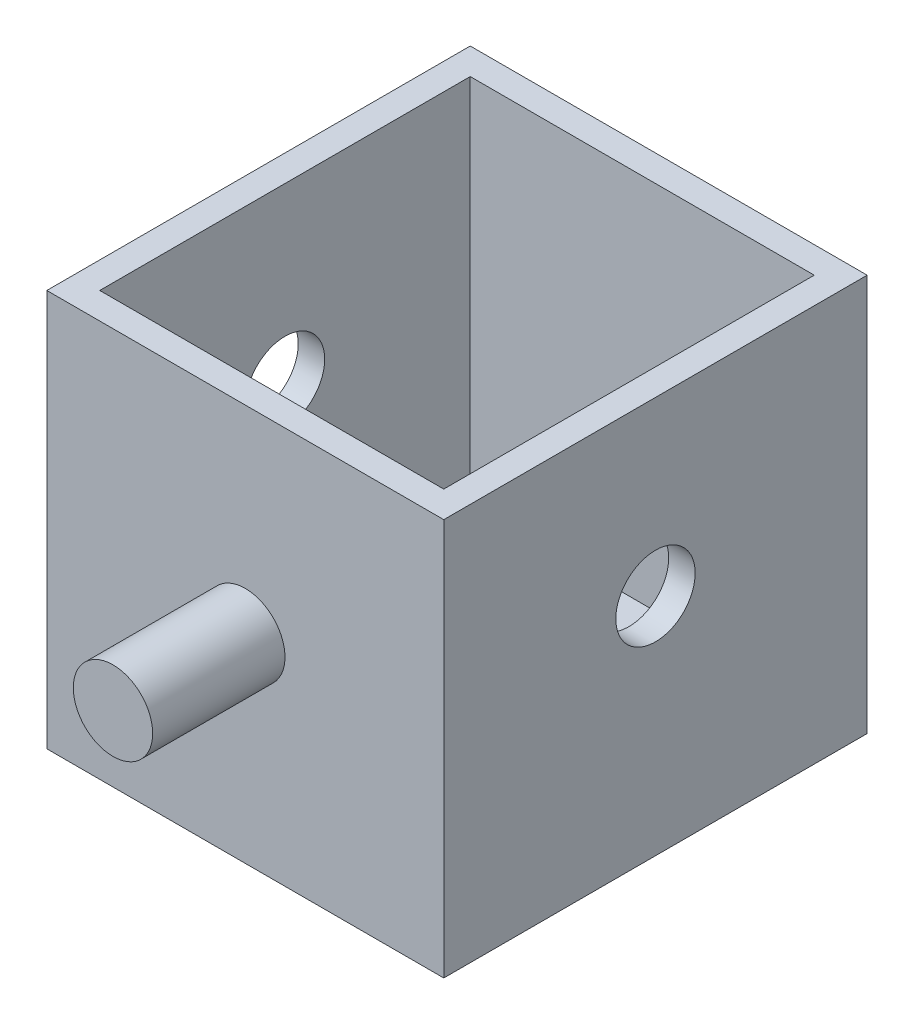
ISO-10303-21;
HEADER;
FILE_DESCRIPTION(('STEP AP214'),'2;1');
FILE_NAME('part.step','',(''),(''),'','','');
FILE_SCHEMA(('AUTOMOTIVE_DESIGN { 1 0 10303 214 1 1 1 1 }'));
ENDSEC;
DATA;
#1=APPLICATION_CONTEXT('core data for automotive mechanical design processes');
#2=APPLICATION_PROTOCOL_DEFINITION('international standard','automotive_design',2000,#1);
#3=PRODUCT_CONTEXT('',#1,'mechanical');
#4=PRODUCT('Part','Part','',(#3));
#5=PRODUCT_RELATED_PRODUCT_CATEGORY('part','',(#4));
#6=PRODUCT_DEFINITION_FORMATION('','',#4);
#7=PRODUCT_DEFINITION_CONTEXT('part definition',#1,'design');
#8=PRODUCT_DEFINITION('design','',#6,#7);
#9=PRODUCT_DEFINITION_SHAPE('','',#8);
#10=(LENGTH_UNIT() NAMED_UNIT(*) SI_UNIT(.MILLI.,.METRE.));
#11=(NAMED_UNIT(*) PLANE_ANGLE_UNIT() SI_UNIT($,.RADIAN.));
#12=(NAMED_UNIT(*) SI_UNIT($,.STERADIAN.) SOLID_ANGLE_UNIT());
#13=UNCERTAINTY_MEASURE_WITH_UNIT(LENGTH_MEASURE(1.E-05),#10,'distance_accuracy_value','');
#14=(GEOMETRIC_REPRESENTATION_CONTEXT(3) GLOBAL_UNCERTAINTY_ASSIGNED_CONTEXT((#13)) GLOBAL_UNIT_ASSIGNED_CONTEXT((#10,
#11,#12)) REPRESENTATION_CONTEXT('',''));
#15=CARTESIAN_POINT('',(0.,0.,0.));
#16=DIRECTION('',(0.,0.,1.));
#17=DIRECTION('',(1.,0.,0.));
#18=AXIS2_PLACEMENT_3D('',#15,#16,#17);
#19=CARTESIAN_POINT('',(0.,0.,0.));
#20=DIRECTION('',(0.,0.,-1.));
#21=DIRECTION('',(-1.,0.,0.));
#22=AXIS2_PLACEMENT_3D('',#19,#20,#21);
#23=PLANE('',#22);
#24=DIRECTION('',(0.,1.,0.));
#25=VECTOR('',#24,1.);
#26=CARTESIAN_POINT('',(19.05,-19.05,0.));
#27=LINE('',#26,#25);
#28=CARTESIAN_POINT('',(19.05,-19.05,0.));
#29=VERTEX_POINT('',#28);
#30=CARTESIAN_POINT('',(19.05,19.05,0.));
#31=VERTEX_POINT('',#30);
#32=EDGE_CURVE('E148',#29,#31,#27,.T.);
#33=ORIENTED_EDGE('',*,*,#32,.F.);
#34=DIRECTION('',(1.,0.,0.));
#35=VECTOR('',#34,1.);
#36=CARTESIAN_POINT('',(-19.05,-19.05,0.));
#37=LINE('',#36,#35);
#38=CARTESIAN_POINT('',(-19.05,-19.05,0.));
#39=VERTEX_POINT('',#38);
#40=EDGE_CURVE('E79',#39,#29,#37,.T.);
#41=ORIENTED_EDGE('',*,*,#40,.F.);
#42=DIRECTION('',(0.,-1.,0.));
#43=VECTOR('',#42,1.);
#44=CARTESIAN_POINT('',(-19.05,-19.05,0.));
#45=LINE('',#44,#43);
#46=CARTESIAN_POINT('',(-19.05,19.05,0.));
#47=VERTEX_POINT('',#46);
#48=EDGE_CURVE('E165',#47,#39,#45,.T.);
#49=ORIENTED_EDGE('',*,*,#48,.F.);
#50=DIRECTION('',(-1.,0.,0.));
#51=VECTOR('',#50,1.);
#52=CARTESIAN_POINT('',(-19.05,19.05,0.));
#53=LINE('',#52,#51);
#54=EDGE_CURVE('E163',#31,#47,#53,.T.);
#55=ORIENTED_EDGE('',*,*,#54,.F.);
#56=EDGE_LOOP('',(#33,#41,#49,#55));
#57=FACE_BOUND('',#56,.T.);
#58=CARTESIAN_POINT('',(0.,0.,0.));
#59=DIRECTION('',(0.,0.,-1.));
#60=DIRECTION('',(-1.,0.,0.));
#61=AXIS2_PLACEMENT_3D('',#58,#59,#60);
#62=CIRCLE('',#61,3.81);
#63=CARTESIAN_POINT('',(-3.81,0.,0.));
#64=VERTEX_POINT('',#63);
#65=EDGE_CURVE('E238',#64,#64,#62,.T.);
#66=ORIENTED_EDGE('',*,*,#65,.F.);
#67=EDGE_LOOP('',(#66));
#68=FACE_BOUND('',#67,.T.);
#69=ADVANCED_FACE('F33',(#57,#68),#23,.T.);
#70=CARTESIAN_POINT('',(0.,0.,40.64));
#71=DIRECTION('',(0.,0.,-1.));
#72=DIRECTION('',(-1.,0.,0.));
#73=AXIS2_PLACEMENT_3D('',#70,#71,#72);
#74=PLANE('',#73);
#75=DIRECTION('',(0.,1.,0.));
#76=VECTOR('',#75,1.);
#77=CARTESIAN_POINT('',(19.05,-19.05,40.64));
#78=LINE('',#77,#76);
#79=CARTESIAN_POINT('',(19.05,-19.05,40.64));
#80=VERTEX_POINT('',#79);
#81=CARTESIAN_POINT('',(19.05,19.05,40.64));
#82=VERTEX_POINT('',#81);
#83=EDGE_CURVE('E154',#80,#82,#78,.T.);
#84=ORIENTED_EDGE('',*,*,#83,.T.);
#85=DIRECTION('',(-1.,0.,0.));
#86=VECTOR('',#85,1.);
#87=CARTESIAN_POINT('',(-19.05,19.05,40.64));
#88=LINE('',#87,#86);
#89=CARTESIAN_POINT('',(-19.05,19.05,40.64));
#90=VERTEX_POINT('',#89);
#91=EDGE_CURVE('E87',#82,#90,#88,.T.);
#92=ORIENTED_EDGE('',*,*,#91,.T.);
#93=DIRECTION('',(0.,-1.,0.));
#94=VECTOR('',#93,1.);
#95=CARTESIAN_POINT('',(-19.05,-19.05,40.64));
#96=LINE('',#95,#94);
#97=CARTESIAN_POINT('',(-19.05,-19.05,40.64));
#98=VERTEX_POINT('',#97);
#99=EDGE_CURVE('E157',#90,#98,#96,.T.);
#100=ORIENTED_EDGE('',*,*,#99,.T.);
#101=DIRECTION('',(1.,0.,0.));
#102=VECTOR('',#101,1.);
#103=CARTESIAN_POINT('',(-19.05,-19.05,40.64));
#104=LINE('',#103,#102);
#105=EDGE_CURVE('E58',#98,#80,#104,.T.);
#106=ORIENTED_EDGE('',*,*,#105,.T.);
#107=EDGE_LOOP('',(#84,#92,#100,#106));
#108=FACE_BOUND('',#107,.T.);
#109=CARTESIAN_POINT('',(0.,0.,40.64));
#110=DIRECTION('',(0.,0.,-1.));
#111=DIRECTION('',(-1.,0.,0.));
#112=AXIS2_PLACEMENT_3D('',#109,#110,#111);
#113=CIRCLE('',#112,3.81);
#114=CARTESIAN_POINT('',(-3.81000000000001,0.,40.64));
#115=VERTEX_POINT('',#114);
#116=EDGE_CURVE('E11',#115,#115,#113,.F.);
#117=ORIENTED_EDGE('',*,*,#116,.F.);
#118=EDGE_LOOP('',(#117));
#119=FACE_BOUND('',#118,.T.);
#120=ADVANCED_FACE('F188',(#108,#119),#74,.F.);
#121=CARTESIAN_POINT('',(-19.05,19.05,40.64));
#122=DIRECTION('',(0.,-1.,0.));
#123=DIRECTION('',(0.,0.,-1.));
#124=AXIS2_PLACEMENT_3D('',#121,#122,#123);
#125=PLANE('',#124);
#126=ORIENTED_EDGE('',*,*,#54,.T.);
#127=DIRECTION('',(0.,0.,-1.));
#128=VECTOR('',#127,1.);
#129=CARTESIAN_POINT('',(-19.05,19.05,40.64));
#130=LINE('',#129,#128);
#131=EDGE_CURVE('E171',#90,#47,#130,.T.);
#132=ORIENTED_EDGE('',*,*,#131,.F.);
#133=ORIENTED_EDGE('',*,*,#91,.F.);
#134=DIRECTION('',(0.,0.,-1.));
#135=VECTOR('',#134,1.);
#136=CARTESIAN_POINT('',(19.05,19.05,40.64));
#137=LINE('',#136,#135);
#138=EDGE_CURVE('E42',#82,#31,#137,.T.);
#139=ORIENTED_EDGE('',*,*,#138,.T.);
#140=EDGE_LOOP('',(#126,#132,#133,#139));
#141=FACE_BOUND('',#140,.T.);
#142=DIRECTION('',(-1.,0.,0.));
#143=VECTOR('',#142,1.);
#144=CARTESIAN_POINT('',(0.,19.05,2.54));
#145=LINE('',#144,#143);
#146=CARTESIAN_POINT('',(16.51,19.05,2.54));
#147=VERTEX_POINT('',#146);
#148=CARTESIAN_POINT('',(-16.51,19.05,2.54));
#149=VERTEX_POINT('',#148);
#150=EDGE_CURVE('E131',#147,#149,#145,.T.);
#151=ORIENTED_EDGE('',*,*,#150,.F.);
#152=DIRECTION('',(0.,0.,-1.));
#153=VECTOR('',#152,1.);
#154=CARTESIAN_POINT('',(16.51,19.05,40.64));
#155=LINE('',#154,#153);
#156=CARTESIAN_POINT('',(16.51,19.05,38.1));
#157=VERTEX_POINT('',#156);
#158=EDGE_CURVE('E130',#157,#147,#155,.T.);
#159=ORIENTED_EDGE('',*,*,#158,.F.);
#160=DIRECTION('',(-1.,0.,0.));
#161=VECTOR('',#160,1.);
#162=CARTESIAN_POINT('',(0.,19.05,38.1));
#163=LINE('',#162,#161);
#164=CARTESIAN_POINT('',(-16.51,19.05,38.1));
#165=VERTEX_POINT('',#164);
#166=EDGE_CURVE('E140',#157,#165,#163,.T.);
#167=ORIENTED_EDGE('',*,*,#166,.T.);
#168=DIRECTION('',(0.,0.,-1.));
#169=VECTOR('',#168,1.);
#170=CARTESIAN_POINT('',(-16.51,19.05,40.64));
#171=LINE('',#170,#169);
#172=EDGE_CURVE('E145',#165,#149,#171,.T.);
#173=ORIENTED_EDGE('',*,*,#172,.T.);
#174=EDGE_LOOP('',(#151,#159,#167,#173));
#175=FACE_BOUND('',#174,.T.);
#176=ADVANCED_FACE('F175',(#141,#175),#125,.F.);
#177=CARTESIAN_POINT('',(19.05,-19.05,40.64));
#178=DIRECTION('',(-1.,0.,0.));
#179=DIRECTION('',(0.,0.,1.));
#180=AXIS2_PLACEMENT_3D('',#177,#178,#179);
#181=PLANE('',#180);
#182=CARTESIAN_POINT('',(19.05,2.53999999999999,20.32));
#183=DIRECTION('',(1.,0.,0.));
#184=DIRECTION('',(0.,0.,-1.));
#185=AXIS2_PLACEMENT_3D('',#182,#183,#184);
#186=CIRCLE('',#185,3.81);
#187=CARTESIAN_POINT('',(19.05,2.53999999999999,16.51));
#188=VERTEX_POINT('',#187);
#189=EDGE_CURVE('E228',#188,#188,#186,.T.);
#190=ORIENTED_EDGE('',*,*,#189,.F.);
#191=EDGE_LOOP('',(#190));
#192=FACE_BOUND('',#191,.T.);
#193=ORIENTED_EDGE('',*,*,#32,.T.);
#194=ORIENTED_EDGE('',*,*,#138,.F.);
#195=ORIENTED_EDGE('',*,*,#83,.F.);
#196=DIRECTION('',(0.,0.,-1.));
#197=VECTOR('',#196,1.);
#198=CARTESIAN_POINT('',(19.05,-19.05,40.64));
#199=LINE('',#198,#197);
#200=EDGE_CURVE('E160',#80,#29,#199,.T.);
#201=ORIENTED_EDGE('',*,*,#200,.T.);
#202=EDGE_LOOP('',(#193,#194,#195,#201));
#203=FACE_BOUND('',#202,.T.);
#204=ADVANCED_FACE('F35',(#192,#203),#181,.F.);
#205=CARTESIAN_POINT('',(-19.05,-19.05,40.64));
#206=DIRECTION('',(1.,0.,0.));
#207=DIRECTION('',(0.,0.,-1.));
#208=AXIS2_PLACEMENT_3D('',#205,#206,#207);
#209=PLANE('',#208);
#210=CARTESIAN_POINT('',(-19.05,2.53999999999999,20.32));
#211=DIRECTION('',(1.,0.,0.));
#212=DIRECTION('',(0.,0.,-1.));
#213=AXIS2_PLACEMENT_3D('',#210,#211,#212);
#214=CIRCLE('',#213,3.81);
#215=CARTESIAN_POINT('',(-19.05,2.53999999999999,16.51));
#216=VERTEX_POINT('',#215);
#217=EDGE_CURVE('E230',#216,#216,#214,.T.);
#218=ORIENTED_EDGE('',*,*,#217,.T.);
#219=EDGE_LOOP('',(#218));
#220=FACE_BOUND('',#219,.T.);
#221=ORIENTED_EDGE('',*,*,#48,.T.);
#222=DIRECTION('',(0.,0.,-1.));
#223=VECTOR('',#222,1.);
#224=CARTESIAN_POINT('',(-19.05,-19.05,40.64));
#225=LINE('',#224,#223);
#226=EDGE_CURVE('E169',#98,#39,#225,.T.);
#227=ORIENTED_EDGE('',*,*,#226,.F.);
#228=ORIENTED_EDGE('',*,*,#99,.F.);
#229=ORIENTED_EDGE('',*,*,#131,.T.);
#230=EDGE_LOOP('',(#221,#227,#228,#229));
#231=FACE_BOUND('',#230,.T.);
#232=ADVANCED_FACE('F185',(#220,#231),#209,.F.);
#233=CARTESIAN_POINT('',(-19.05,-19.05,40.64));
#234=DIRECTION('',(0.,1.,0.));
#235=DIRECTION('',(0.,0.,1.));
#236=AXIS2_PLACEMENT_3D('',#233,#234,#235);
#237=PLANE('',#236);
#238=ORIENTED_EDGE('',*,*,#40,.T.);
#239=ORIENTED_EDGE('',*,*,#200,.F.);
#240=ORIENTED_EDGE('',*,*,#105,.F.);
#241=ORIENTED_EDGE('',*,*,#226,.T.);
#242=EDGE_LOOP('',(#238,#239,#240,#241));
#243=FACE_BOUND('',#242,.T.);
#244=ADVANCED_FACE('F187',(#243),#237,.F.);
#245=CARTESIAN_POINT('',(16.51,-19.05,40.64));
#246=DIRECTION('',(-1.,0.,0.));
#247=DIRECTION('',(0.,0.,1.));
#248=AXIS2_PLACEMENT_3D('',#245,#246,#247);
#249=PLANE('',#248);
#250=CARTESIAN_POINT('',(16.51,2.53999999999999,20.32));
#251=DIRECTION('',(-1.,0.,0.));
#252=DIRECTION('',(0.,0.,1.));
#253=AXIS2_PLACEMENT_3D('',#250,#251,#252);
#254=CIRCLE('',#253,3.81);
#255=CARTESIAN_POINT('',(16.51,2.53999999999999,16.51));
#256=VERTEX_POINT('',#255);
#257=EDGE_CURVE('E235',#256,#256,#254,.T.);
#258=ORIENTED_EDGE('',*,*,#257,.F.);
#259=EDGE_LOOP('',(#258));
#260=FACE_BOUND('',#259,.T.);
#261=DIRECTION('',(0.,1.,0.));
#262=VECTOR('',#261,1.);
#263=CARTESIAN_POINT('',(16.51,0.,2.54));
#264=LINE('',#263,#262);
#265=CARTESIAN_POINT('',(16.51,-16.51,2.54));
#266=VERTEX_POINT('',#265);
#267=EDGE_CURVE('E114',#266,#147,#264,.T.);
#268=ORIENTED_EDGE('',*,*,#267,.F.);
#269=DIRECTION('',(0.,0.,-1.));
#270=VECTOR('',#269,1.);
#271=CARTESIAN_POINT('',(16.51,-16.51,40.64));
#272=LINE('',#271,#270);
#273=CARTESIAN_POINT('',(16.51,-16.51,38.1));
#274=VERTEX_POINT('',#273);
#275=EDGE_CURVE('E122',#274,#266,#272,.T.);
#276=ORIENTED_EDGE('',*,*,#275,.F.);
#277=DIRECTION('',(0.,1.,0.));
#278=VECTOR('',#277,1.);
#279=CARTESIAN_POINT('',(16.51,0.,38.1));
#280=LINE('',#279,#278);
#281=EDGE_CURVE('E49',#274,#157,#280,.T.);
#282=ORIENTED_EDGE('',*,*,#281,.T.);
#283=ORIENTED_EDGE('',*,*,#158,.T.);
#284=EDGE_LOOP('',(#268,#276,#282,#283));
#285=FACE_BOUND('',#284,.T.);
#286=ADVANCED_FACE('F128',(#260,#285),#249,.T.);
#287=CARTESIAN_POINT('',(-16.51,-19.05,40.64));
#288=DIRECTION('',(1.,0.,0.));
#289=DIRECTION('',(0.,0.,-1.));
#290=AXIS2_PLACEMENT_3D('',#287,#288,#289);
#291=PLANE('',#290);
#292=CARTESIAN_POINT('',(-16.51,2.53999999999999,20.32));
#293=DIRECTION('',(1.,0.,0.));
#294=DIRECTION('',(0.,0.,-1.));
#295=AXIS2_PLACEMENT_3D('',#292,#293,#294);
#296=CIRCLE('',#295,3.81);
#297=CARTESIAN_POINT('',(-16.51,2.53999999999999,16.51));
#298=VERTEX_POINT('',#297);
#299=EDGE_CURVE('E37',#298,#298,#296,.T.);
#300=ORIENTED_EDGE('',*,*,#299,.F.);
#301=EDGE_LOOP('',(#300));
#302=FACE_BOUND('',#301,.T.);
#303=DIRECTION('',(0.,-1.,0.));
#304=VECTOR('',#303,1.);
#305=CARTESIAN_POINT('',(-16.51,0.,2.54));
#306=LINE('',#305,#304);
#307=CARTESIAN_POINT('',(-16.51,-16.51,2.54));
#308=VERTEX_POINT('',#307);
#309=EDGE_CURVE('E117',#149,#308,#306,.T.);
#310=ORIENTED_EDGE('',*,*,#309,.F.);
#311=ORIENTED_EDGE('',*,*,#172,.F.);
#312=DIRECTION('',(0.,-1.,0.));
#313=VECTOR('',#312,1.);
#314=CARTESIAN_POINT('',(-16.51,0.,38.1));
#315=LINE('',#314,#313);
#316=CARTESIAN_POINT('',(-16.51,-16.51,38.1));
#317=VERTEX_POINT('',#316);
#318=EDGE_CURVE('E143',#165,#317,#315,.T.);
#319=ORIENTED_EDGE('',*,*,#318,.T.);
#320=DIRECTION('',(0.,0.,-1.));
#321=VECTOR('',#320,1.);
#322=CARTESIAN_POINT('',(-16.51,-16.51,40.64));
#323=LINE('',#322,#321);
#324=EDGE_CURVE('E126',#317,#308,#323,.T.);
#325=ORIENTED_EDGE('',*,*,#324,.T.);
#326=EDGE_LOOP('',(#310,#311,#319,#325));
#327=FACE_BOUND('',#326,.T.);
#328=ADVANCED_FACE('F267',(#302,#327),#291,.T.);
#329=CARTESIAN_POINT('',(-19.05,-16.51,40.64));
#330=DIRECTION('',(0.,1.,0.));
#331=DIRECTION('',(0.,0.,1.));
#332=AXIS2_PLACEMENT_3D('',#329,#330,#331);
#333=PLANE('',#332);
#334=DIRECTION('',(1.,0.,0.));
#335=VECTOR('',#334,1.);
#336=CARTESIAN_POINT('',(0.,-16.51,2.54));
#337=LINE('',#336,#335);
#338=EDGE_CURVE('E110',#308,#266,#337,.T.);
#339=ORIENTED_EDGE('',*,*,#338,.F.);
#340=ORIENTED_EDGE('',*,*,#324,.F.);
#341=DIRECTION('',(1.,0.,0.));
#342=VECTOR('',#341,1.);
#343=CARTESIAN_POINT('',(0.,-16.51,38.1));
#344=LINE('',#343,#342);
#345=EDGE_CURVE('E125',#317,#274,#344,.T.);
#346=ORIENTED_EDGE('',*,*,#345,.T.);
#347=ORIENTED_EDGE('',*,*,#275,.T.);
#348=EDGE_LOOP('',(#339,#340,#346,#347));
#349=FACE_BOUND('',#348,.T.);
#350=ADVANCED_FACE('F123',(#349),#333,.T.);
#351=CARTESIAN_POINT('',(0.,0.,38.1));
#352=DIRECTION('',(0.,0.,-1.));
#353=DIRECTION('',(-1.,0.,0.));
#354=AXIS2_PLACEMENT_3D('',#351,#352,#353);
#355=PLANE('',#354);
#356=ORIENTED_EDGE('',*,*,#281,.F.);
#357=ORIENTED_EDGE('',*,*,#345,.F.);
#358=ORIENTED_EDGE('',*,*,#318,.F.);
#359=ORIENTED_EDGE('',*,*,#166,.F.);
#360=EDGE_LOOP('',(#356,#357,#358,#359));
#361=FACE_BOUND('',#360,.T.);
#362=ADVANCED_FACE('F206',(#361),#355,.T.);
#363=CARTESIAN_POINT('',(0.,0.,2.54));
#364=DIRECTION('',(0.,0.,-1.));
#365=DIRECTION('',(-1.,0.,0.));
#366=AXIS2_PLACEMENT_3D('',#363,#364,#365);
#367=PLANE('',#366);
#368=ORIENTED_EDGE('',*,*,#267,.T.);
#369=ORIENTED_EDGE('',*,*,#150,.T.);
#370=ORIENTED_EDGE('',*,*,#309,.T.);
#371=ORIENTED_EDGE('',*,*,#338,.T.);
#372=EDGE_LOOP('',(#368,#369,#370,#371));
#373=FACE_BOUND('',#372,.T.);
#374=ADVANCED_FACE('F112',(#373),#367,.F.);
#375=CARTESIAN_POINT('',(0.,0.,53.34));
#376=DIRECTION('',(0.,0.,-1.));
#377=DIRECTION('',(-1.,0.,0.));
#378=AXIS2_PLACEMENT_3D('',#375,#376,#377);
#379=CYLINDRICAL_SURFACE('',#378,3.81);
#380=CARTESIAN_POINT('',(0.,0.,53.34));
#381=DIRECTION('',(0.,0.,1.));
#382=DIRECTION('',(1.,0.,0.));
#383=AXIS2_PLACEMENT_3D('',#380,#381,#382);
#384=CIRCLE('',#383,3.81);
#385=CARTESIAN_POINT('',(3.80999999999999,0.,53.34));
#386=VERTEX_POINT('',#385);
#387=EDGE_CURVE('E132',#386,#386,#384,.T.);
#388=ORIENTED_EDGE('',*,*,#387,.F.);
#389=EDGE_LOOP('',(#388));
#390=FACE_BOUND('',#389,.T.);
#391=ORIENTED_EDGE('',*,*,#116,.T.);
#392=EDGE_LOOP('',(#391));
#393=FACE_BOUND('',#392,.T.);
#394=ADVANCED_FACE('F194',(#390,#393),#379,.T.);
#395=CARTESIAN_POINT('',(0.,0.,53.34));
#396=DIRECTION('',(0.,0.,1.));
#397=DIRECTION('',(1.,0.,0.));
#398=AXIS2_PLACEMENT_3D('',#395,#396,#397);
#399=PLANE('',#398);
#400=ORIENTED_EDGE('',*,*,#387,.T.);
#401=EDGE_LOOP('',(#400));
#402=FACE_BOUND('',#401,.T.);
#403=ADVANCED_FACE('F196',(#402),#399,.T.);
#404=CARTESIAN_POINT('',(0.,0.,-12.7));
#405=DIRECTION('',(0.,0.,1.));
#406=DIRECTION('',(1.,0.,0.));
#407=AXIS2_PLACEMENT_3D('',#404,#405,#406);
#408=CYLINDRICAL_SURFACE('',#407,3.81);
#409=CARTESIAN_POINT('',(0.,0.,-12.7));
#410=DIRECTION('',(0.,0.,-1.));
#411=DIRECTION('',(-1.,0.,0.));
#412=AXIS2_PLACEMENT_3D('',#409,#410,#411);
#413=CIRCLE('',#412,3.81);
#414=CARTESIAN_POINT('',(-3.81,0.,-12.7));
#415=VERTEX_POINT('',#414);
#416=EDGE_CURVE('E136',#415,#415,#413,.T.);
#417=ORIENTED_EDGE('',*,*,#416,.F.);
#418=EDGE_LOOP('',(#417));
#419=FACE_BOUND('',#418,.T.);
#420=ORIENTED_EDGE('',*,*,#65,.T.);
#421=EDGE_LOOP('',(#420));
#422=FACE_BOUND('',#421,.T.);
#423=ADVANCED_FACE('F203',(#419,#422),#408,.T.);
#424=CARTESIAN_POINT('',(0.,0.,-12.7));
#425=DIRECTION('',(0.,0.,-1.));
#426=DIRECTION('',(-1.,0.,0.));
#427=AXIS2_PLACEMENT_3D('',#424,#425,#426);
#428=PLANE('',#427);
#429=ORIENTED_EDGE('',*,*,#416,.T.);
#430=EDGE_LOOP('',(#429));
#431=FACE_BOUND('',#430,.T.);
#432=ADVANCED_FACE('F244',(#431),#428,.T.);
#433=CARTESIAN_POINT('',(-19.05,2.53999999999999,20.32));
#434=DIRECTION('',(1.,0.,0.));
#435=DIRECTION('',(0.,0.,-1.));
#436=AXIS2_PLACEMENT_3D('',#433,#434,#435);
#437=CYLINDRICAL_SURFACE('',#436,3.81);
#438=CARTESIAN_POINT('',(-16.51,2.53999999999999,16.51));
#439=CARTESIAN_POINT('',(-16.5364583333333,2.53999999999999,16.51));
#440=CARTESIAN_POINT('',(-16.5629166666667,2.53999999999999,16.51));
#441=CARTESIAN_POINT('',(-16.6158333333333,2.53999999999999,16.51));
#442=CARTESIAN_POINT('',(-16.6422916666667,2.53999999999999,16.51));
#443=CARTESIAN_POINT('',(-16.6952083333333,2.53999999999999,16.51));
#444=CARTESIAN_POINT('',(-16.7216666666667,2.53999999999999,16.51));
#445=CARTESIAN_POINT('',(-16.7745833333333,2.53999999999999,16.51));
#446=CARTESIAN_POINT('',(-16.8010416666667,2.53999999999999,16.51));
#447=CARTESIAN_POINT('',(-16.8539583333333,2.53999999999999,16.51));
#448=CARTESIAN_POINT('',(-16.8804166666667,2.53999999999999,16.51));
#449=CARTESIAN_POINT('',(-16.9333333333333,2.53999999999999,16.51));
#450=CARTESIAN_POINT('',(-16.9597916666667,2.53999999999999,16.51));
#451=CARTESIAN_POINT('',(-17.0127083333333,2.53999999999999,16.51));
#452=CARTESIAN_POINT('',(-17.0391666666667,2.53999999999999,16.51));
#453=CARTESIAN_POINT('',(-17.0920833333333,2.53999999999999,16.51));
#454=CARTESIAN_POINT('',(-17.1185416666667,2.53999999999999,16.51));
#455=CARTESIAN_POINT('',(-17.1714583333333,2.53999999999999,16.51));
#456=CARTESIAN_POINT('',(-17.1979166666667,2.53999999999999,16.51));
#457=CARTESIAN_POINT('',(-17.2508333333333,2.53999999999999,16.51));
#458=CARTESIAN_POINT('',(-17.2772916666667,2.53999999999999,16.51));
#459=CARTESIAN_POINT('',(-17.3302083333333,2.53999999999999,16.51));
#460=CARTESIAN_POINT('',(-17.3566666666667,2.53999999999999,16.51));
#461=CARTESIAN_POINT('',(-17.4095833333333,2.53999999999999,16.51));
#462=CARTESIAN_POINT('',(-17.4360416666667,2.53999999999999,16.51));
#463=CARTESIAN_POINT('',(-17.4889583333333,2.53999999999999,16.51));
#464=CARTESIAN_POINT('',(-17.5154166666667,2.53999999999999,16.51));
#465=CARTESIAN_POINT('',(-17.5683333333333,2.53999999999999,16.51));
#466=CARTESIAN_POINT('',(-17.5947916666667,2.53999999999999,16.51));
#467=CARTESIAN_POINT('',(-17.6477083333333,2.53999999999999,16.51));
#468=CARTESIAN_POINT('',(-17.6741666666667,2.53999999999999,16.51));
#469=CARTESIAN_POINT('',(-17.7270833333333,2.53999999999999,16.51));
#470=CARTESIAN_POINT('',(-17.7535416666667,2.53999999999999,16.51));
#471=CARTESIAN_POINT('',(-17.8064583333333,2.53999999999999,16.51));
#472=CARTESIAN_POINT('',(-17.8329166666667,2.53999999999999,16.51));
#473=CARTESIAN_POINT('',(-17.8858333333333,2.53999999999999,16.51));
#474=CARTESIAN_POINT('',(-17.9122916666667,2.53999999999999,16.51));
#475=CARTESIAN_POINT('',(-17.9652083333333,2.53999999999999,16.51));
#476=CARTESIAN_POINT('',(-17.9916666666667,2.53999999999999,16.51));
#477=CARTESIAN_POINT('',(-18.0445833333333,2.53999999999999,16.51));
#478=CARTESIAN_POINT('',(-18.0710416666667,2.53999999999999,16.51));
#479=CARTESIAN_POINT('',(-18.1239583333333,2.53999999999999,16.51));
#480=CARTESIAN_POINT('',(-18.1504166666667,2.53999999999999,16.51));
#481=CARTESIAN_POINT('',(-18.2033333333333,2.53999999999999,16.51));
#482=CARTESIAN_POINT('',(-18.2297916666667,2.53999999999999,16.51));
#483=CARTESIAN_POINT('',(-18.2827083333333,2.53999999999999,16.51));
#484=CARTESIAN_POINT('',(-18.3091666666667,2.53999999999999,16.51));
#485=CARTESIAN_POINT('',(-18.3620833333333,2.53999999999999,16.51));
#486=CARTESIAN_POINT('',(-18.3885416666667,2.53999999999999,16.51));
#487=CARTESIAN_POINT('',(-18.4414583333333,2.53999999999999,16.51));
#488=CARTESIAN_POINT('',(-18.4679166666667,2.53999999999999,16.51));
#489=CARTESIAN_POINT('',(-18.5208333333333,2.53999999999999,16.51));
#490=CARTESIAN_POINT('',(-18.5472916666667,2.53999999999999,16.51));
#491=CARTESIAN_POINT('',(-18.6002083333333,2.53999999999999,16.51));
#492=CARTESIAN_POINT('',(-18.6266666666667,2.53999999999999,16.51));
#493=CARTESIAN_POINT('',(-18.6795833333333,2.53999999999999,16.51));
#494=CARTESIAN_POINT('',(-18.7060416666667,2.53999999999999,16.51));
#495=CARTESIAN_POINT('',(-18.7589583333333,2.53999999999999,16.51));
#496=CARTESIAN_POINT('',(-18.7854166666667,2.53999999999999,16.51));
#497=CARTESIAN_POINT('',(-18.8383333333333,2.53999999999999,16.51));
#498=CARTESIAN_POINT('',(-18.8647916666667,2.53999999999999,16.51));
#499=CARTESIAN_POINT('',(-18.9177083333333,2.53999999999999,16.51));
#500=CARTESIAN_POINT('',(-18.9441666666667,2.53999999999999,16.51));
#501=CARTESIAN_POINT('',(-18.9970833333333,2.53999999999999,16.51));
#502=CARTESIAN_POINT('',(-19.0235416666667,2.53999999999999,16.51));
#503=CARTESIAN_POINT('',(-19.05,2.53999999999999,16.51));
#504=B_SPLINE_CURVE_WITH_KNOTS('',3,(#438,#439,#440,#441,#442,#443,#444,#445,#446,#447,#448,
#449,#450,#451,#452,#453,#454,#455,#456,#457,#458,#459,#460,#461,#462,#463,#464,#465,#466,#467,
#468,#469,#470,#471,#472,#473,#474,#475,#476,#477,#478,#479,#480,#481,#482,#483,#484,#485,#486,
#487,#488,#489,#490,#491,#492,#493,#494,#495,#496,#497,#498,#499,#500,#501,#502,#503),
.UNSPECIFIED.,.F.,.F.,(4,2,2,2,2,2,2,2,2,2,2,2,2,2,2,2,2,2,2,2,2,2,2,2,2,2,2,2,2,2,2,2,4),(0.,
0.0793749999999996,0.158749999999999,0.238124999999999,0.317499999999998,0.396874999999998,
0.476249999999998,0.555625000000001,0.635,0.714375,0.793749999999999,0.873124999999999,
0.952499999999998,1.031875,1.11125,1.190625,1.27,1.349375,1.42875,1.508125,1.5875,1.666875,
1.74625,1.825625,1.905,1.984375,2.06375,2.143125,2.2225,2.301875,2.38125,2.460625,2.54),.UNSPECIFIED.);
#505=EDGE_CURVE('BSEAM250',#298,#216,#504,.T.);
#506=ORIENTED_EDGE('',*,*,#299,.T.);
#507=ORIENTED_EDGE('',*,*,#217,.F.);
#508=ORIENTED_EDGE('',*,*,#505,.T.);
#509=ORIENTED_EDGE('',*,*,#505,.F.);
#510=EDGE_LOOP('',(#506,#508,#507,#509));
#511=FACE_BOUND('',#510,.T.);
#512=ADVANCED_FACE('F250',(#511),#437,.F.);
#513=CARTESIAN_POINT('',(16.51,2.53999999999999,16.51));
#514=CARTESIAN_POINT('',(16.5364583333333,2.53999999999999,16.51));
#515=CARTESIAN_POINT('',(16.5629166666667,2.53999999999999,16.51));
#516=CARTESIAN_POINT('',(16.6158333333333,2.53999999999999,16.51));
#517=CARTESIAN_POINT('',(16.6422916666667,2.53999999999999,16.51));
#518=CARTESIAN_POINT('',(16.6952083333333,2.53999999999999,16.51));
#519=CARTESIAN_POINT('',(16.7216666666667,2.53999999999999,16.51));
#520=CARTESIAN_POINT('',(16.7745833333333,2.53999999999999,16.51));
#521=CARTESIAN_POINT('',(16.8010416666667,2.53999999999999,16.51));
#522=CARTESIAN_POINT('',(16.8539583333333,2.53999999999999,16.51));
#523=CARTESIAN_POINT('',(16.8804166666667,2.53999999999999,16.51));
#524=CARTESIAN_POINT('',(16.9333333333333,2.53999999999999,16.51));
#525=CARTESIAN_POINT('',(16.9597916666667,2.53999999999999,16.51));
#526=CARTESIAN_POINT('',(17.0127083333333,2.53999999999999,16.51));
#527=CARTESIAN_POINT('',(17.0391666666667,2.53999999999999,16.51));
#528=CARTESIAN_POINT('',(17.0920833333333,2.53999999999999,16.51));
#529=CARTESIAN_POINT('',(17.1185416666667,2.53999999999999,16.51));
#530=CARTESIAN_POINT('',(17.1714583333333,2.53999999999999,16.51));
#531=CARTESIAN_POINT('',(17.1979166666667,2.53999999999999,16.51));
#532=CARTESIAN_POINT('',(17.2508333333333,2.53999999999999,16.51));
#533=CARTESIAN_POINT('',(17.2772916666667,2.53999999999999,16.51));
#534=CARTESIAN_POINT('',(17.3302083333333,2.53999999999999,16.51));
#535=CARTESIAN_POINT('',(17.3566666666667,2.53999999999999,16.51));
#536=CARTESIAN_POINT('',(17.4095833333333,2.53999999999999,16.51));
#537=CARTESIAN_POINT('',(17.4360416666667,2.53999999999999,16.51));
#538=CARTESIAN_POINT('',(17.4889583333333,2.53999999999999,16.51));
#539=CARTESIAN_POINT('',(17.5154166666667,2.53999999999999,16.51));
#540=CARTESIAN_POINT('',(17.5683333333333,2.53999999999999,16.51));
#541=CARTESIAN_POINT('',(17.5947916666667,2.53999999999999,16.51));
#542=CARTESIAN_POINT('',(17.6477083333333,2.53999999999999,16.51));
#543=CARTESIAN_POINT('',(17.6741666666667,2.53999999999999,16.51));
#544=CARTESIAN_POINT('',(17.7270833333333,2.53999999999999,16.51));
#545=CARTESIAN_POINT('',(17.7535416666667,2.53999999999999,16.51));
#546=CARTESIAN_POINT('',(17.8064583333333,2.53999999999999,16.51));
#547=CARTESIAN_POINT('',(17.8329166666667,2.53999999999999,16.51));
#548=CARTESIAN_POINT('',(17.8858333333333,2.53999999999999,16.51));
#549=CARTESIAN_POINT('',(17.9122916666667,2.53999999999999,16.51));
#550=CARTESIAN_POINT('',(17.9652083333333,2.53999999999999,16.51));
#551=CARTESIAN_POINT('',(17.9916666666667,2.53999999999999,16.51));
#552=CARTESIAN_POINT('',(18.0445833333333,2.53999999999999,16.51));
#553=CARTESIAN_POINT('',(18.0710416666667,2.53999999999999,16.51));
#554=CARTESIAN_POINT('',(18.1239583333333,2.53999999999999,16.51));
#555=CARTESIAN_POINT('',(18.1504166666667,2.53999999999999,16.51));
#556=CARTESIAN_POINT('',(18.2033333333333,2.53999999999999,16.51));
#557=CARTESIAN_POINT('',(18.2297916666667,2.53999999999999,16.51));
#558=CARTESIAN_POINT('',(18.2827083333333,2.53999999999999,16.51));
#559=CARTESIAN_POINT('',(18.3091666666667,2.53999999999999,16.51));
#560=CARTESIAN_POINT('',(18.3620833333333,2.53999999999999,16.51));
#561=CARTESIAN_POINT('',(18.3885416666667,2.53999999999999,16.51));
#562=CARTESIAN_POINT('',(18.4414583333333,2.53999999999999,16.51));
#563=CARTESIAN_POINT('',(18.4679166666667,2.53999999999999,16.51));
#564=CARTESIAN_POINT('',(18.5208333333333,2.53999999999999,16.51));
#565=CARTESIAN_POINT('',(18.5472916666667,2.53999999999999,16.51));
#566=CARTESIAN_POINT('',(18.6002083333333,2.53999999999999,16.51));
#567=CARTESIAN_POINT('',(18.6266666666667,2.53999999999999,16.51));
#568=CARTESIAN_POINT('',(18.6795833333333,2.53999999999999,16.51));
#569=CARTESIAN_POINT('',(18.7060416666667,2.53999999999999,16.51));
#570=CARTESIAN_POINT('',(18.7589583333333,2.53999999999999,16.51));
#571=CARTESIAN_POINT('',(18.7854166666667,2.53999999999999,16.51));
#572=CARTESIAN_POINT('',(18.8383333333333,2.53999999999999,16.51));
#573=CARTESIAN_POINT('',(18.8647916666667,2.53999999999999,16.51));
#574=CARTESIAN_POINT('',(18.9177083333333,2.53999999999999,16.51));
#575=CARTESIAN_POINT('',(18.9441666666667,2.53999999999999,16.51));
#576=CARTESIAN_POINT('',(18.9970833333333,2.53999999999999,16.51));
#577=CARTESIAN_POINT('',(19.0235416666667,2.53999999999999,16.51));
#578=CARTESIAN_POINT('',(19.05,2.53999999999999,16.51));
#579=B_SPLINE_CURVE_WITH_KNOTS('',3,(#513,#514,#515,#516,#517,#518,#519,#520,#521,#522,#523,
#524,#525,#526,#527,#528,#529,#530,#531,#532,#533,#534,#535,#536,#537,#538,#539,#540,#541,#542,
#543,#544,#545,#546,#547,#548,#549,#550,#551,#552,#553,#554,#555,#556,#557,#558,#559,#560,#561,
#562,#563,#564,#565,#566,#567,#568,#569,#570,#571,#572,#573,#574,#575,#576,#577,#578),
.UNSPECIFIED.,.F.,.F.,(4,2,2,2,2,2,2,2,2,2,2,2,2,2,2,2,2,2,2,2,2,2,2,2,2,2,2,2,2,2,2,2,4),(0.,
0.0793749999999996,0.158749999999999,0.238124999999999,0.317499999999998,0.396874999999998,
0.476249999999998,0.555624999999997,0.634999999999997,0.714375000000003,0.793750000000003,
0.873125000000002,0.952500000000002,1.031875,1.11125,1.190625,1.27,1.349375,1.42875,1.508125,
1.5875,1.666875,1.74625,1.825625,1.905,1.984375,2.06375,2.143125,2.2225,2.301875,2.38125,
2.460625,2.54),.UNSPECIFIED.);
#580=EDGE_CURVE('BSEAM256',#256,#188,#579,.T.);
#581=ORIENTED_EDGE('',*,*,#257,.T.);
#582=ORIENTED_EDGE('',*,*,#189,.T.);
#583=ORIENTED_EDGE('',*,*,#580,.T.);
#584=ORIENTED_EDGE('',*,*,#580,.F.);
#585=EDGE_LOOP('',(#581,#583,#582,#584));
#586=FACE_BOUND('',#585,.T.);
#587=ADVANCED_FACE('F256',(#586),#437,.F.);
#588=CLOSED_SHELL('',(#69,#120,#176,#204,#232,#244,#286,#328,#350,#362,#374,#394,#403,#423,#432,
#512,#587));
#589=MANIFOLD_SOLID_BREP('B2',#588);
#590=ADVANCED_BREP_SHAPE_REPRESENTATION('',(#18,#589),#14);
#591=SHAPE_DEFINITION_REPRESENTATION(#9,#590);
ENDSEC;
END-ISO-10303-21;
